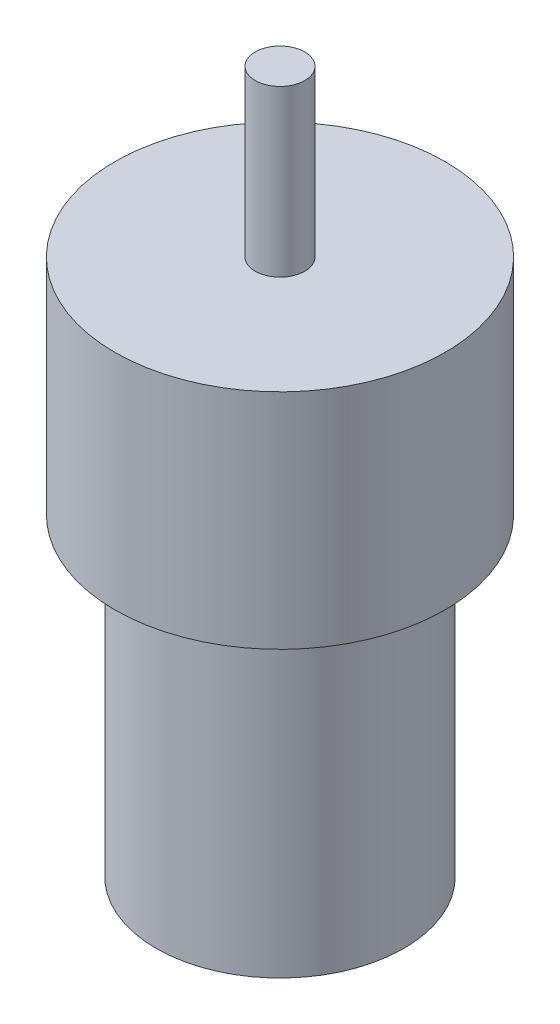
ISO-10303-21;
HEADER;
FILE_DESCRIPTION(('STEP AP214'),'2;1');
FILE_NAME('part.step','',(''),(''),'','','');
FILE_SCHEMA(('AUTOMOTIVE_DESIGN { 1 0 10303 214 1 1 1 1 }'));
ENDSEC;
DATA;
#1=APPLICATION_CONTEXT('core data for automotive mechanical design processes');
#2=APPLICATION_PROTOCOL_DEFINITION('international standard','automotive_design',2000,#1);
#3=PRODUCT_CONTEXT('',#1,'mechanical');
#4=PRODUCT('Part','Part','',(#3));
#5=PRODUCT_RELATED_PRODUCT_CATEGORY('part','',(#4));
#6=PRODUCT_DEFINITION_FORMATION('','',#4);
#7=PRODUCT_DEFINITION_CONTEXT('part definition',#1,'design');
#8=PRODUCT_DEFINITION('design','',#6,#7);
#9=PRODUCT_DEFINITION_SHAPE('','',#8);
#10=(LENGTH_UNIT() NAMED_UNIT(*) SI_UNIT(.MILLI.,.METRE.));
#11=(NAMED_UNIT(*) PLANE_ANGLE_UNIT() SI_UNIT($,.RADIAN.));
#12=(NAMED_UNIT(*) SI_UNIT($,.STERADIAN.) SOLID_ANGLE_UNIT());
#13=UNCERTAINTY_MEASURE_WITH_UNIT(LENGTH_MEASURE(1.E-05),#10,'distance_accuracy_value','');
#14=(GEOMETRIC_REPRESENTATION_CONTEXT(3) GLOBAL_UNCERTAINTY_ASSIGNED_CONTEXT((#13)) GLOBAL_UNIT_ASSIGNED_CONTEXT((#10,
#11,#12)) REPRESENTATION_CONTEXT('',''));
#15=CARTESIAN_POINT('',(0.,0.,0.));
#16=DIRECTION('',(0.,0.,1.));
#17=DIRECTION('',(1.,0.,0.));
#18=AXIS2_PLACEMENT_3D('',#15,#16,#17);
#19=CARTESIAN_POINT('',(0.,85.,0.));
#20=DIRECTION('',(0.,-1.,0.));
#21=DIRECTION('',(0.,0.,-1.));
#22=AXIS2_PLACEMENT_3D('',#19,#20,#21);
#23=PLANE('',#22);
#24=CARTESIAN_POINT('',(0.,85.,0.));
#25=DIRECTION('',(0.,1.,0.));
#26=DIRECTION('',(0.,0.,1.));
#27=AXIS2_PLACEMENT_3D('',#24,#25,#26);
#28=CIRCLE('',#27,3.);
#29=CARTESIAN_POINT('',(0.,85.,3.));
#30=VERTEX_POINT('',#29);
#31=EDGE_CURVE('E10',#30,#30,#28,.T.);
#32=ORIENTED_EDGE('',*,*,#31,.T.);
#33=EDGE_LOOP('',(#32));
#34=FACE_BOUND('',#33,.T.);
#35=ADVANCED_FACE('F37',(#34),#23,.F.);
#36=CARTESIAN_POINT('',(0.,85.,0.));
#37=DIRECTION('',(0.,1.,0.));
#38=DIRECTION('',(0.,0.,1.));
#39=AXIS2_PLACEMENT_3D('',#36,#37,#38);
#40=CYLINDRICAL_SURFACE('',#39,3.);
#41=ORIENTED_EDGE('',*,*,#31,.F.);
#42=EDGE_LOOP('',(#41));
#43=FACE_BOUND('',#42,.T.);
#44=CARTESIAN_POINT('',(0.,65.,0.));
#45=DIRECTION('',(0.,1.,0.));
#46=DIRECTION('',(0.,0.,1.));
#47=AXIS2_PLACEMENT_3D('',#44,#45,#46);
#48=CIRCLE('',#47,3.);
#49=CARTESIAN_POINT('',(0.,65.,3.));
#50=VERTEX_POINT('',#49);
#51=EDGE_CURVE('E43',#50,#50,#48,.T.);
#52=ORIENTED_EDGE('',*,*,#51,.T.);
#53=EDGE_LOOP('',(#52));
#54=FACE_BOUND('',#53,.T.);
#55=ADVANCED_FACE('F75',(#43,#54),#40,.T.);
#56=CARTESIAN_POINT('',(3.,65.,0.));
#57=DIRECTION('',(0.,-1.,0.));
#58=DIRECTION('',(0.,0.,-1.));
#59=AXIS2_PLACEMENT_3D('',#56,#57,#58);
#60=PLANE('',#59);
#61=ORIENTED_EDGE('',*,*,#51,.F.);
#62=EDGE_LOOP('',(#61));
#63=FACE_BOUND('',#62,.T.);
#64=CARTESIAN_POINT('',(0.,65.,0.));
#65=DIRECTION('',(0.,1.,0.));
#66=DIRECTION('',(0.,0.,1.));
#67=AXIS2_PLACEMENT_3D('',#64,#65,#66);
#68=CIRCLE('',#67,20.);
#69=CARTESIAN_POINT('',(0.,65.,20.));
#70=VERTEX_POINT('',#69);
#71=EDGE_CURVE('E47',#70,#70,#68,.T.);
#72=ORIENTED_EDGE('',*,*,#71,.T.);
#73=EDGE_LOOP('',(#72));
#74=FACE_BOUND('',#73,.T.);
#75=ADVANCED_FACE('F79',(#63,#74),#60,.F.);
#76=CARTESIAN_POINT('',(0.,85.,0.));
#77=DIRECTION('',(0.,1.,0.));
#78=DIRECTION('',(0.,0.,1.));
#79=AXIS2_PLACEMENT_3D('',#76,#77,#78);
#80=CYLINDRICAL_SURFACE('',#79,20.);
#81=ORIENTED_EDGE('',*,*,#71,.F.);
#82=EDGE_LOOP('',(#81));
#83=FACE_BOUND('',#82,.T.);
#84=CARTESIAN_POINT('',(0.,38.,0.));
#85=DIRECTION('',(0.,1.,0.));
#86=DIRECTION('',(0.,0.,1.));
#87=AXIS2_PLACEMENT_3D('',#84,#85,#86);
#88=CIRCLE('',#87,20.);
#89=CARTESIAN_POINT('',(0.,38.,20.));
#90=VERTEX_POINT('',#89);
#91=EDGE_CURVE('E51',#90,#90,#88,.T.);
#92=ORIENTED_EDGE('',*,*,#91,.T.);
#93=EDGE_LOOP('',(#92));
#94=FACE_BOUND('',#93,.T.);
#95=ADVANCED_FACE('F84',(#83,#94),#80,.T.);
#96=CARTESIAN_POINT('',(15.,38.,0.));
#97=DIRECTION('',(0.,1.,0.));
#98=DIRECTION('',(0.,0.,1.));
#99=AXIS2_PLACEMENT_3D('',#96,#97,#98);
#100=PLANE('',#99);
#101=ORIENTED_EDGE('',*,*,#91,.F.);
#102=EDGE_LOOP('',(#101));
#103=FACE_BOUND('',#102,.T.);
#104=CARTESIAN_POINT('',(0.,38.,0.));
#105=DIRECTION('',(0.,1.,0.));
#106=DIRECTION('',(0.,0.,1.));
#107=AXIS2_PLACEMENT_3D('',#104,#105,#106);
#108=CIRCLE('',#107,15.);
#109=CARTESIAN_POINT('',(0.,38.,15.));
#110=VERTEX_POINT('',#109);
#111=EDGE_CURVE('E56',#110,#110,#108,.T.);
#112=ORIENTED_EDGE('',*,*,#111,.T.);
#113=EDGE_LOOP('',(#112));
#114=FACE_BOUND('',#113,.T.);
#115=ADVANCED_FACE('F71',(#103,#114),#100,.F.);
#116=CARTESIAN_POINT('',(0.,85.,0.));
#117=DIRECTION('',(0.,1.,0.));
#118=DIRECTION('',(0.,0.,1.));
#119=AXIS2_PLACEMENT_3D('',#116,#117,#118);
#120=CYLINDRICAL_SURFACE('',#119,15.);
#121=ORIENTED_EDGE('',*,*,#111,.F.);
#122=EDGE_LOOP('',(#121));
#123=FACE_BOUND('',#122,.T.);
#124=CARTESIAN_POINT('',(0.,0.,0.));
#125=DIRECTION('',(0.,1.,0.));
#126=DIRECTION('',(0.,0.,1.));
#127=AXIS2_PLACEMENT_3D('',#124,#125,#126);
#128=CIRCLE('',#127,15.);
#129=CARTESIAN_POINT('',(0.,0.,15.));
#130=VERTEX_POINT('',#129);
#131=EDGE_CURVE('E59',#130,#130,#128,.T.);
#132=ORIENTED_EDGE('',*,*,#131,.T.);
#133=EDGE_LOOP('',(#132));
#134=FACE_BOUND('',#133,.T.);
#135=ADVANCED_FACE('F63',(#123,#134),#120,.T.);
#136=CARTESIAN_POINT('',(0.,0.,0.));
#137=DIRECTION('',(0.,1.,0.));
#138=DIRECTION('',(0.,0.,1.));
#139=AXIS2_PLACEMENT_3D('',#136,#137,#138);
#140=PLANE('',#139);
#141=ORIENTED_EDGE('',*,*,#131,.F.);
#142=EDGE_LOOP('',(#141));
#143=FACE_BOUND('',#142,.T.);
#144=ADVANCED_FACE('F65',(#143),#140,.F.);
#145=CLOSED_SHELL('',(#35,#55,#75,#95,#115,#135,#144));
#146=MANIFOLD_SOLID_BREP('B2',#145);
#147=ADVANCED_BREP_SHAPE_REPRESENTATION('',(#18,#146),#14);
#148=SHAPE_DEFINITION_REPRESENTATION(#9,#147);
ENDSEC;
END-ISO-10303-21;
